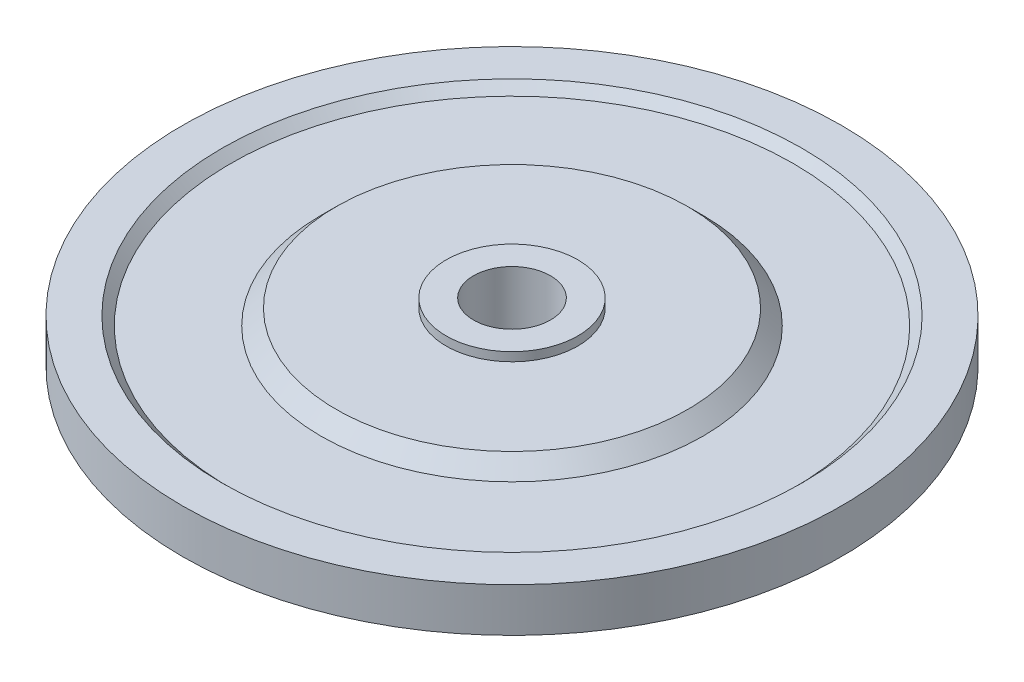
ISO-10303-21;
HEADER;
FILE_DESCRIPTION(('STEP AP214'),'2;1');
FILE_NAME('part.step','',(''),(''),'','','');
FILE_SCHEMA(('AUTOMOTIVE_DESIGN { 1 0 10303 214 1 1 1 1 }'));
ENDSEC;
DATA;
#1=APPLICATION_CONTEXT('core data for automotive mechanical design processes');
#2=APPLICATION_PROTOCOL_DEFINITION('international standard','automotive_design',2000,#1);
#3=PRODUCT_CONTEXT('',#1,'mechanical');
#4=PRODUCT('Part','Part','',(#3));
#5=PRODUCT_RELATED_PRODUCT_CATEGORY('part','',(#4));
#6=PRODUCT_DEFINITION_FORMATION('','',#4);
#7=PRODUCT_DEFINITION_CONTEXT('part definition',#1,'design');
#8=PRODUCT_DEFINITION('design','',#6,#7);
#9=PRODUCT_DEFINITION_SHAPE('','',#8);
#10=(LENGTH_UNIT() NAMED_UNIT(*) SI_UNIT(.MILLI.,.METRE.));
#11=(NAMED_UNIT(*) PLANE_ANGLE_UNIT() SI_UNIT($,.RADIAN.));
#12=(NAMED_UNIT(*) SI_UNIT($,.STERADIAN.) SOLID_ANGLE_UNIT());
#13=UNCERTAINTY_MEASURE_WITH_UNIT(LENGTH_MEASURE(1.E-05),#10,'distance_accuracy_value','');
#14=(GEOMETRIC_REPRESENTATION_CONTEXT(3) GLOBAL_UNCERTAINTY_ASSIGNED_CONTEXT((#13)) GLOBAL_UNIT_ASSIGNED_CONTEXT((#10,
#11,#12)) REPRESENTATION_CONTEXT('',''));
#15=CARTESIAN_POINT('',(0.,0.,0.));
#16=DIRECTION('',(0.,0.,1.));
#17=DIRECTION('',(1.,0.,0.));
#18=AXIS2_PLACEMENT_3D('',#15,#16,#17);
#19=CARTESIAN_POINT('',(-32.5,0.,0.));
#20=DIRECTION('',(0.,1.,0.));
#21=DIRECTION('',(0.,0.,1.));
#22=AXIS2_PLACEMENT_3D('',#19,#20,#21);
#23=PLANE('',#22);
#24=CARTESIAN_POINT('',(0.,0.,0.));
#25=DIRECTION('',(0.,-1.,0.));
#26=DIRECTION('',(0.,0.,-1.));
#27=AXIS2_PLACEMENT_3D('',#24,#25,#26);
#28=CIRCLE('',#27,17.5);
#29=CARTESIAN_POINT('',(0.,0.,-17.5));
#30=VERTEX_POINT('',#29);
#31=EDGE_CURVE('E10',#30,#30,#28,.T.);
#32=ORIENTED_EDGE('',*,*,#31,.F.);
#33=EDGE_LOOP('',(#32));
#34=FACE_BOUND('',#33,.T.);
#35=CARTESIAN_POINT('',(0.,0.,0.));
#36=DIRECTION('',(0.,-1.,0.));
#37=DIRECTION('',(0.,0.,-1.));
#38=AXIS2_PLACEMENT_3D('',#35,#36,#37);
#39=CIRCLE('',#38,32.5);
#40=CARTESIAN_POINT('',(0.,0.,-32.5));
#41=VERTEX_POINT('',#40);
#42=EDGE_CURVE('E77',#41,#41,#39,.T.);
#43=ORIENTED_EDGE('',*,*,#42,.T.);
#44=EDGE_LOOP('',(#43));
#45=FACE_BOUND('',#44,.T.);
#46=ADVANCED_FACE('F31',(#34,#45),#23,.F.);
#47=CARTESIAN_POINT('',(0.,0.,0.));
#48=DIRECTION('',(0.,-1.,0.));
#49=DIRECTION('',(0.,0.,-1.));
#50=AXIS2_PLACEMENT_3D('',#47,#48,#49);
#51=CYLINDRICAL_SURFACE('',#50,17.5);
#52=CARTESIAN_POINT('',(0.,34.,0.));
#53=DIRECTION('',(0.,-1.,0.));
#54=DIRECTION('',(0.,0.,-1.));
#55=AXIS2_PLACEMENT_3D('',#52,#53,#54);
#56=CIRCLE('',#55,17.5);
#57=CARTESIAN_POINT('',(0.,34.,-17.5));
#58=VERTEX_POINT('',#57);
#59=EDGE_CURVE('E37',#58,#58,#56,.T.);
#60=ORIENTED_EDGE('',*,*,#59,.F.);
#61=EDGE_LOOP('',(#60));
#62=FACE_BOUND('',#61,.T.);
#63=ORIENTED_EDGE('',*,*,#31,.T.);
#64=EDGE_LOOP('',(#63));
#65=FACE_BOUND('',#64,.T.);
#66=ADVANCED_FACE('F150',(#62,#65),#51,.F.);
#67=CARTESIAN_POINT('',(-17.5,34.,0.));
#68=DIRECTION('',(0.,-1.,0.));
#69=DIRECTION('',(0.,0.,-1.));
#70=AXIS2_PLACEMENT_3D('',#67,#68,#69);
#71=PLANE('',#70);
#72=CARTESIAN_POINT('',(0.,34.,0.));
#73=DIRECTION('',(0.,-1.,0.));
#74=DIRECTION('',(0.,0.,-1.));
#75=AXIS2_PLACEMENT_3D('',#72,#73,#74);
#76=CIRCLE('',#75,30.);
#77=CARTESIAN_POINT('',(0.,34.,-30.));
#78=VERTEX_POINT('',#77);
#79=EDGE_CURVE('E41',#78,#78,#76,.T.);
#80=ORIENTED_EDGE('',*,*,#79,.F.);
#81=EDGE_LOOP('',(#80));
#82=FACE_BOUND('',#81,.T.);
#83=ORIENTED_EDGE('',*,*,#59,.T.);
#84=EDGE_LOOP('',(#83));
#85=FACE_BOUND('',#84,.T.);
#86=ADVANCED_FACE('F145',(#82,#85),#71,.F.);
#87=CARTESIAN_POINT('',(0.,0.,0.));
#88=DIRECTION('',(0.,-1.,0.));
#89=DIRECTION('',(0.,0.,-1.));
#90=AXIS2_PLACEMENT_3D('',#87,#88,#89);
#91=CYLINDRICAL_SURFACE('',#90,30.);
#92=CARTESIAN_POINT('',(0.,30.,0.));
#93=DIRECTION('',(0.,-1.,0.));
#94=DIRECTION('',(0.,0.,-1.));
#95=AXIS2_PLACEMENT_3D('',#92,#93,#94);
#96=CIRCLE('',#95,30.);
#97=CARTESIAN_POINT('',(0.,30.,-30.));
#98=VERTEX_POINT('',#97);
#99=EDGE_CURVE('E45',#98,#98,#96,.T.);
#100=ORIENTED_EDGE('',*,*,#99,.F.);
#101=EDGE_LOOP('',(#100));
#102=FACE_BOUND('',#101,.T.);
#103=ORIENTED_EDGE('',*,*,#79,.T.);
#104=EDGE_LOOP('',(#103));
#105=FACE_BOUND('',#104,.T.);
#106=ADVANCED_FACE('F139',(#102,#105),#91,.T.);
#107=CARTESIAN_POINT('',(-30.,30.,0.));
#108=DIRECTION('',(0.,-1.,0.));
#109=DIRECTION('',(0.,0.,-1.));
#110=AXIS2_PLACEMENT_3D('',#107,#108,#109);
#111=PLANE('',#110);
#112=CARTESIAN_POINT('',(0.,30.,0.));
#113=DIRECTION('',(0.,-1.,0.));
#114=DIRECTION('',(0.,0.,-1.));
#115=AXIS2_PLACEMENT_3D('',#112,#113,#114);
#116=CIRCLE('',#115,80.);
#117=CARTESIAN_POINT('',(0.,30.,-80.));
#118=VERTEX_POINT('',#117);
#119=EDGE_CURVE('E50',#118,#118,#116,.T.);
#120=ORIENTED_EDGE('',*,*,#119,.F.);
#121=EDGE_LOOP('',(#120));
#122=FACE_BOUND('',#121,.T.);
#123=ORIENTED_EDGE('',*,*,#99,.T.);
#124=EDGE_LOOP('',(#123));
#125=FACE_BOUND('',#124,.T.);
#126=ADVANCED_FACE('F133',(#122,#125),#111,.F.);
#127=CARTESIAN_POINT('',(0.,30.,0.));
#128=DIRECTION('',(0.,-1.,0.));
#129=DIRECTION('',(0.,0.,-1.));
#130=AXIS2_PLACEMENT_3D('',#127,#128,#129);
#131=CONICAL_SURFACE('',#130,80.,0.785398163397447);
#132=CARTESIAN_POINT('',(0.,23.,0.));
#133=DIRECTION('',(0.,-1.,0.));
#134=DIRECTION('',(0.,0.,-1.));
#135=AXIS2_PLACEMENT_3D('',#132,#133,#134);
#136=CIRCLE('',#135,86.9999999999999);
#137=CARTESIAN_POINT('',(0.,23.,-86.9999999999999));
#138=VERTEX_POINT('',#137);
#139=EDGE_CURVE('E53',#138,#138,#136,.T.);
#140=ORIENTED_EDGE('',*,*,#139,.F.);
#141=EDGE_LOOP('',(#140));
#142=FACE_BOUND('',#141,.T.);
#143=ORIENTED_EDGE('',*,*,#119,.T.);
#144=EDGE_LOOP('',(#143));
#145=FACE_BOUND('',#144,.T.);
#146=ADVANCED_FACE('F127',(#142,#145),#131,.T.);
#147=CARTESIAN_POINT('',(-86.9999999999999,23.,0.));
#148=DIRECTION('',(0.,-1.,0.));
#149=DIRECTION('',(0.,0.,-1.));
#150=AXIS2_PLACEMENT_3D('',#147,#148,#149);
#151=PLANE('',#150);
#152=CARTESIAN_POINT('',(0.,23.,0.));
#153=DIRECTION('',(0.,-1.,0.));
#154=DIRECTION('',(0.,0.,-1.));
#155=AXIS2_PLACEMENT_3D('',#152,#153,#154);
#156=CIRCLE('',#155,128.);
#157=CARTESIAN_POINT('',(0.,23.,-128.));
#158=VERTEX_POINT('',#157);
#159=EDGE_CURVE('E56',#158,#158,#156,.T.);
#160=ORIENTED_EDGE('',*,*,#159,.F.);
#161=EDGE_LOOP('',(#160));
#162=FACE_BOUND('',#161,.T.);
#163=ORIENTED_EDGE('',*,*,#139,.T.);
#164=EDGE_LOOP('',(#163));
#165=FACE_BOUND('',#164,.T.);
#166=ADVANCED_FACE('F121',(#162,#165),#151,.F.);
#167=CARTESIAN_POINT('',(0.,23.,0.));
#168=DIRECTION('',(0.,1.,0.));
#169=DIRECTION('',(0.,0.,1.));
#170=AXIS2_PLACEMENT_3D('',#167,#168,#169);
#171=CONICAL_SURFACE('',#170,128.,0.785398163397448);
#172=CARTESIAN_POINT('',(0.,27.,0.));
#173=DIRECTION('',(0.,-1.,0.));
#174=DIRECTION('',(0.,0.,-1.));
#175=AXIS2_PLACEMENT_3D('',#172,#173,#174);
#176=CIRCLE('',#175,132.);
#177=CARTESIAN_POINT('',(0.,27.,-132.));
#178=VERTEX_POINT('',#177);
#179=EDGE_CURVE('E59',#178,#178,#176,.T.);
#180=ORIENTED_EDGE('',*,*,#179,.F.);
#181=EDGE_LOOP('',(#180));
#182=FACE_BOUND('',#181,.T.);
#183=ORIENTED_EDGE('',*,*,#159,.T.);
#184=EDGE_LOOP('',(#183));
#185=FACE_BOUND('',#184,.T.);
#186=ADVANCED_FACE('F115',(#182,#185),#171,.F.);
#187=CARTESIAN_POINT('',(-132.,27.,0.));
#188=DIRECTION('',(0.,-1.,0.));
#189=DIRECTION('',(0.,0.,-1.));
#190=AXIS2_PLACEMENT_3D('',#187,#188,#189);
#191=PLANE('',#190);
#192=CARTESIAN_POINT('',(0.,27.,0.));
#193=DIRECTION('',(0.,-1.,0.));
#194=DIRECTION('',(0.,0.,-1.));
#195=AXIS2_PLACEMENT_3D('',#192,#193,#194);
#196=CIRCLE('',#195,150.);
#197=CARTESIAN_POINT('',(0.,27.,-150.));
#198=VERTEX_POINT('',#197);
#199=EDGE_CURVE('E62',#198,#198,#196,.T.);
#200=ORIENTED_EDGE('',*,*,#199,.F.);
#201=EDGE_LOOP('',(#200));
#202=FACE_BOUND('',#201,.T.);
#203=ORIENTED_EDGE('',*,*,#179,.T.);
#204=EDGE_LOOP('',(#203));
#205=FACE_BOUND('',#204,.T.);
#206=ADVANCED_FACE('F109',(#202,#205),#191,.F.);
#207=CARTESIAN_POINT('',(0.,0.,0.));
#208=DIRECTION('',(0.,-1.,0.));
#209=DIRECTION('',(0.,0.,-1.));
#210=AXIS2_PLACEMENT_3D('',#207,#208,#209);
#211=CYLINDRICAL_SURFACE('',#210,150.);
#212=CARTESIAN_POINT('',(0.,7.00000000000003,0.));
#213=DIRECTION('',(0.,-1.,0.));
#214=DIRECTION('',(0.,0.,-1.));
#215=AXIS2_PLACEMENT_3D('',#212,#213,#214);
#216=CIRCLE('',#215,150.);
#217=CARTESIAN_POINT('',(0.,7.00000000000003,-150.));
#218=VERTEX_POINT('',#217);
#219=EDGE_CURVE('E65',#218,#218,#216,.T.);
#220=ORIENTED_EDGE('',*,*,#219,.F.);
#221=EDGE_LOOP('',(#220));
#222=FACE_BOUND('',#221,.T.);
#223=ORIENTED_EDGE('',*,*,#199,.T.);
#224=EDGE_LOOP('',(#223));
#225=FACE_BOUND('',#224,.T.);
#226=ADVANCED_FACE('F103',(#222,#225),#211,.T.);
#227=CARTESIAN_POINT('',(-150.,7.00000000000003,0.));
#228=DIRECTION('',(0.,1.,0.));
#229=DIRECTION('',(0.,0.,1.));
#230=AXIS2_PLACEMENT_3D('',#227,#228,#229);
#231=PLANE('',#230);
#232=CARTESIAN_POINT('',(0.,7.00000000000003,0.));
#233=DIRECTION('',(0.,-1.,0.));
#234=DIRECTION('',(0.,0.,-1.));
#235=AXIS2_PLACEMENT_3D('',#232,#233,#234);
#236=CIRCLE('',#235,132.);
#237=CARTESIAN_POINT('',(0.,7.00000000000003,-132.));
#238=VERTEX_POINT('',#237);
#239=EDGE_CURVE('E68',#238,#238,#236,.T.);
#240=ORIENTED_EDGE('',*,*,#239,.F.);
#241=EDGE_LOOP('',(#240));
#242=FACE_BOUND('',#241,.T.);
#243=ORIENTED_EDGE('',*,*,#219,.T.);
#244=EDGE_LOOP('',(#243));
#245=FACE_BOUND('',#244,.T.);
#246=ADVANCED_FACE('F97',(#242,#245),#231,.F.);
#247=CARTESIAN_POINT('',(0.,7.00000000000003,0.));
#248=DIRECTION('',(0.,-1.,0.));
#249=DIRECTION('',(0.,0.,-1.));
#250=AXIS2_PLACEMENT_3D('',#247,#248,#249);
#251=CONICAL_SURFACE('',#250,132.,0.785398163397442);
#252=CARTESIAN_POINT('',(0.,11.,0.));
#253=DIRECTION('',(0.,-1.,0.));
#254=DIRECTION('',(0.,0.,-1.));
#255=AXIS2_PLACEMENT_3D('',#252,#253,#254);
#256=CIRCLE('',#255,128.);
#257=CARTESIAN_POINT('',(0.,11.,-128.));
#258=VERTEX_POINT('',#257);
#259=EDGE_CURVE('E71',#258,#258,#256,.T.);
#260=ORIENTED_EDGE('',*,*,#259,.F.);
#261=EDGE_LOOP('',(#260));
#262=FACE_BOUND('',#261,.T.);
#263=ORIENTED_EDGE('',*,*,#239,.T.);
#264=EDGE_LOOP('',(#263));
#265=FACE_BOUND('',#264,.T.);
#266=ADVANCED_FACE('F91',(#262,#265),#251,.F.);
#267=CARTESIAN_POINT('',(-128.,11.,0.));
#268=DIRECTION('',(0.,1.,0.));
#269=DIRECTION('',(0.,0.,1.));
#270=AXIS2_PLACEMENT_3D('',#267,#268,#269);
#271=PLANE('',#270);
#272=CARTESIAN_POINT('',(0.,11.,0.));
#273=DIRECTION('',(0.,-1.,0.));
#274=DIRECTION('',(0.,0.,-1.));
#275=AXIS2_PLACEMENT_3D('',#272,#273,#274);
#276=CIRCLE('',#275,32.5);
#277=CARTESIAN_POINT('',(0.,11.,-32.5));
#278=VERTEX_POINT('',#277);
#279=EDGE_CURVE('E74',#278,#278,#276,.T.);
#280=ORIENTED_EDGE('',*,*,#279,.F.);
#281=EDGE_LOOP('',(#280));
#282=FACE_BOUND('',#281,.T.);
#283=ORIENTED_EDGE('',*,*,#259,.T.);
#284=EDGE_LOOP('',(#283));
#285=FACE_BOUND('',#284,.T.);
#286=ADVANCED_FACE('F85',(#282,#285),#271,.F.);
#287=CARTESIAN_POINT('',(0.,0.,0.));
#288=DIRECTION('',(0.,-1.,0.));
#289=DIRECTION('',(0.,0.,-1.));
#290=AXIS2_PLACEMENT_3D('',#287,#288,#289);
#291=CYLINDRICAL_SURFACE('',#290,32.5);
#292=ORIENTED_EDGE('',*,*,#42,.F.);
#293=EDGE_LOOP('',(#292));
#294=FACE_BOUND('',#293,.T.);
#295=ORIENTED_EDGE('',*,*,#279,.T.);
#296=EDGE_LOOP('',(#295));
#297=FACE_BOUND('',#296,.T.);
#298=ADVANCED_FACE('F82',(#294,#297),#291,.T.);
#299=CLOSED_SHELL('',(#46,#66,#86,#106,#126,#146,#166,#186,#206,#226,#246,#266,#286,#298));
#300=MANIFOLD_SOLID_BREP('B2',#299);
#301=ADVANCED_BREP_SHAPE_REPRESENTATION('',(#18,#300),#14);
#302=SHAPE_DEFINITION_REPRESENTATION(#9,#301);
ENDSEC;
END-ISO-10303-21;
